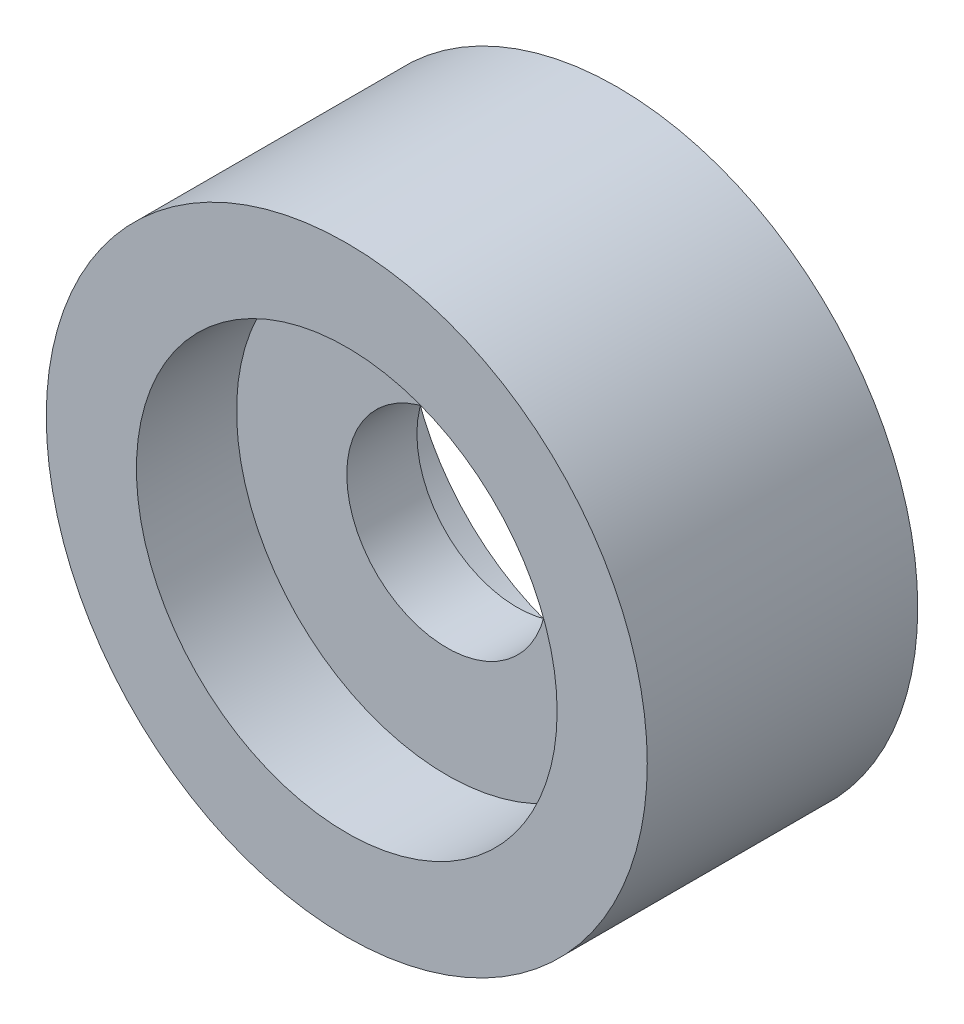
ISO-10303-21;
HEADER;
FILE_DESCRIPTION(('STEP AP214'),'2;1');
FILE_NAME('part.step','',(''),(''),'','','');
FILE_SCHEMA(('AUTOMOTIVE_DESIGN { 1 0 10303 214 1 1 1 1 }'));
ENDSEC;
DATA;
#1=APPLICATION_CONTEXT('core data for automotive mechanical design processes');
#2=APPLICATION_PROTOCOL_DEFINITION('international standard','automotive_design',2000,#1);
#3=PRODUCT_CONTEXT('',#1,'mechanical');
#4=PRODUCT('Part','Part','',(#3));
#5=PRODUCT_RELATED_PRODUCT_CATEGORY('part','',(#4));
#6=PRODUCT_DEFINITION_FORMATION('','',#4);
#7=PRODUCT_DEFINITION_CONTEXT('part definition',#1,'design');
#8=PRODUCT_DEFINITION('design','',#6,#7);
#9=PRODUCT_DEFINITION_SHAPE('','',#8);
#10=(LENGTH_UNIT() NAMED_UNIT(*) SI_UNIT(.MILLI.,.METRE.));
#11=(NAMED_UNIT(*) PLANE_ANGLE_UNIT() SI_UNIT($,.RADIAN.));
#12=(NAMED_UNIT(*) SI_UNIT($,.STERADIAN.) SOLID_ANGLE_UNIT());
#13=UNCERTAINTY_MEASURE_WITH_UNIT(LENGTH_MEASURE(1.E-05),#10,'distance_accuracy_value','');
#14=(GEOMETRIC_REPRESENTATION_CONTEXT(3) GLOBAL_UNCERTAINTY_ASSIGNED_CONTEXT((#13)) GLOBAL_UNIT_ASSIGNED_CONTEXT((#10,
#11,#12)) REPRESENTATION_CONTEXT('',''));
#15=CARTESIAN_POINT('',(0.,0.,0.));
#16=DIRECTION('',(0.,0.,1.));
#17=DIRECTION('',(1.,0.,0.));
#18=AXIS2_PLACEMENT_3D('',#15,#16,#17);
#19=CARTESIAN_POINT('',(0.,0.,27.));
#20=DIRECTION('',(0.,0.,-1.));
#21=DIRECTION('',(-1.,0.,0.));
#22=AXIS2_PLACEMENT_3D('',#19,#20,#21);
#23=CYLINDRICAL_SURFACE('',#22,30.);
#24=CARTESIAN_POINT('',(0.,0.,27.));
#25=DIRECTION('',(0.,0.,1.));
#26=DIRECTION('',(1.,0.,0.));
#27=AXIS2_PLACEMENT_3D('',#24,#25,#26);
#28=CIRCLE('',#27,30.);
#29=CARTESIAN_POINT('',(30.,0.,27.));
#30=VERTEX_POINT('',#29);
#31=EDGE_CURVE('E10',#30,#30,#28,.T.);
#32=ORIENTED_EDGE('',*,*,#31,.F.);
#33=EDGE_LOOP('',(#32));
#34=FACE_BOUND('',#33,.T.);
#35=CARTESIAN_POINT('',(0.,0.,0.));
#36=DIRECTION('',(0.,0.,1.));
#37=DIRECTION('',(1.,0.,0.));
#38=AXIS2_PLACEMENT_3D('',#35,#36,#37);
#39=CIRCLE('',#38,30.);
#40=CARTESIAN_POINT('',(30.,0.,0.));
#41=VERTEX_POINT('',#40);
#42=EDGE_CURVE('E34',#41,#41,#39,.T.);
#43=ORIENTED_EDGE('',*,*,#42,.T.);
#44=EDGE_LOOP('',(#43));
#45=FACE_BOUND('',#44,.T.);
#46=ADVANCED_FACE('F31',(#34,#45),#23,.T.);
#47=CARTESIAN_POINT('',(0.,0.,27.));
#48=DIRECTION('',(0.,0.,1.));
#49=DIRECTION('',(1.,0.,0.));
#50=AXIS2_PLACEMENT_3D('',#47,#48,#49);
#51=PLANE('',#50);
#52=CARTESIAN_POINT('',(0.,0.,27.));
#53=DIRECTION('',(0.,0.,1.));
#54=DIRECTION('',(1.,0.,0.));
#55=AXIS2_PLACEMENT_3D('',#52,#53,#54);
#56=CIRCLE('',#55,21.);
#57=CARTESIAN_POINT('',(21.,0.,27.));
#58=VERTEX_POINT('',#57);
#59=EDGE_CURVE('E43',#58,#58,#56,.T.);
#60=ORIENTED_EDGE('',*,*,#59,.F.);
#61=EDGE_LOOP('',(#60));
#62=FACE_BOUND('',#61,.T.);
#63=ORIENTED_EDGE('',*,*,#31,.T.);
#64=EDGE_LOOP('',(#63));
#65=FACE_BOUND('',#64,.T.);
#66=ADVANCED_FACE('F80',(#62,#65),#51,.T.);
#67=CARTESIAN_POINT('',(0.,0.,0.));
#68=DIRECTION('',(0.,0.,1.));
#69=DIRECTION('',(1.,0.,0.));
#70=AXIS2_PLACEMENT_3D('',#67,#68,#69);
#71=PLANE('',#70);
#72=CARTESIAN_POINT('',(0.,0.,0.));
#73=DIRECTION('',(0.,0.,-1.));
#74=DIRECTION('',(-1.,0.,0.));
#75=AXIS2_PLACEMENT_3D('',#72,#73,#74);
#76=CIRCLE('',#75,21.);
#77=CARTESIAN_POINT('',(-21.,0.,0.));
#78=VERTEX_POINT('',#77);
#79=EDGE_CURVE('E49',#78,#78,#76,.T.);
#80=ORIENTED_EDGE('',*,*,#79,.F.);
#81=EDGE_LOOP('',(#80));
#82=FACE_BOUND('',#81,.T.);
#83=ORIENTED_EDGE('',*,*,#42,.F.);
#84=EDGE_LOOP('',(#83));
#85=FACE_BOUND('',#84,.T.);
#86=ADVANCED_FACE('F76',(#82,#85),#71,.F.);
#87=CARTESIAN_POINT('',(0.,0.,17.));
#88=DIRECTION('',(0.,0.,1.));
#89=DIRECTION('',(1.,0.,0.));
#90=AXIS2_PLACEMENT_3D('',#87,#88,#89);
#91=CYLINDRICAL_SURFACE('',#90,21.);
#92=CARTESIAN_POINT('',(0.,0.,17.));
#93=DIRECTION('',(0.,0.,1.));
#94=DIRECTION('',(1.,0.,0.));
#95=AXIS2_PLACEMENT_3D('',#92,#93,#94);
#96=CIRCLE('',#95,21.);
#97=CARTESIAN_POINT('',(21.,0.,17.));
#98=VERTEX_POINT('',#97);
#99=EDGE_CURVE('E41',#98,#98,#96,.T.);
#100=ORIENTED_EDGE('',*,*,#99,.F.);
#101=EDGE_LOOP('',(#100));
#102=FACE_BOUND('',#101,.T.);
#103=ORIENTED_EDGE('',*,*,#59,.T.);
#104=EDGE_LOOP('',(#103));
#105=FACE_BOUND('',#104,.T.);
#106=ADVANCED_FACE('F79',(#102,#105),#91,.F.);
#107=CARTESIAN_POINT('',(0.,0.,17.));
#108=DIRECTION('',(0.,0.,1.));
#109=DIRECTION('',(1.,0.,0.));
#110=AXIS2_PLACEMENT_3D('',#107,#108,#109);
#111=PLANE('',#110);
#112=CARTESIAN_POINT('',(0.,0.,17.));
#113=DIRECTION('',(0.,0.,1.));
#114=DIRECTION('',(1.,0.,0.));
#115=AXIS2_PLACEMENT_3D('',#112,#113,#114);
#116=CIRCLE('',#115,10.);
#117=CARTESIAN_POINT('',(10.,0.,17.));
#118=VERTEX_POINT('',#117);
#119=EDGE_CURVE('E52',#118,#118,#116,.T.);
#120=ORIENTED_EDGE('',*,*,#119,.F.);
#121=EDGE_LOOP('',(#120));
#122=FACE_BOUND('',#121,.T.);
#123=ORIENTED_EDGE('',*,*,#99,.T.);
#124=EDGE_LOOP('',(#123));
#125=FACE_BOUND('',#124,.T.);
#126=ADVANCED_FACE('F72',(#122,#125),#111,.T.);
#127=CARTESIAN_POINT('',(0.,0.,10.));
#128=DIRECTION('',(0.,0.,-1.));
#129=DIRECTION('',(-1.,0.,0.));
#130=AXIS2_PLACEMENT_3D('',#127,#128,#129);
#131=CYLINDRICAL_SURFACE('',#130,21.);
#132=CARTESIAN_POINT('',(0.,0.,10.));
#133=DIRECTION('',(0.,0.,-1.));
#134=DIRECTION('',(-1.,0.,0.));
#135=AXIS2_PLACEMENT_3D('',#132,#133,#134);
#136=CIRCLE('',#135,21.);
#137=CARTESIAN_POINT('',(-21.,0.,10.));
#138=VERTEX_POINT('',#137);
#139=EDGE_CURVE('E46',#138,#138,#136,.T.);
#140=ORIENTED_EDGE('',*,*,#139,.F.);
#141=EDGE_LOOP('',(#140));
#142=FACE_BOUND('',#141,.T.);
#143=ORIENTED_EDGE('',*,*,#79,.T.);
#144=EDGE_LOOP('',(#143));
#145=FACE_BOUND('',#144,.T.);
#146=ADVANCED_FACE('F66',(#142,#145),#131,.F.);
#147=CARTESIAN_POINT('',(0.,0.,10.));
#148=DIRECTION('',(0.,0.,-1.));
#149=DIRECTION('',(-1.,0.,0.));
#150=AXIS2_PLACEMENT_3D('',#147,#148,#149);
#151=PLANE('',#150);
#152=CARTESIAN_POINT('',(0.,0.,10.));
#153=DIRECTION('',(0.,0.,-1.));
#154=DIRECTION('',(-1.,0.,0.));
#155=AXIS2_PLACEMENT_3D('',#152,#153,#154);
#156=CIRCLE('',#155,10.);
#157=CARTESIAN_POINT('',(-10.,0.,10.));
#158=VERTEX_POINT('',#157);
#159=EDGE_CURVE('E57',#158,#158,#156,.T.);
#160=ORIENTED_EDGE('',*,*,#159,.F.);
#161=EDGE_LOOP('',(#160));
#162=FACE_BOUND('',#161,.T.);
#163=ORIENTED_EDGE('',*,*,#139,.T.);
#164=EDGE_LOOP('',(#163));
#165=FACE_BOUND('',#164,.T.);
#166=ADVANCED_FACE('F63',(#162,#165),#151,.T.);
#167=CARTESIAN_POINT('',(0.,0.,20.));
#168=DIRECTION('',(0.,0.,-1.));
#169=DIRECTION('',(-1.,0.,0.));
#170=AXIS2_PLACEMENT_3D('',#167,#168,#169);
#171=CYLINDRICAL_SURFACE('',#170,10.);
#172=ORIENTED_EDGE('',*,*,#119,.T.);
#173=EDGE_LOOP('',(#172));
#174=FACE_BOUND('',#173,.T.);
#175=ORIENTED_EDGE('',*,*,#159,.T.);
#176=EDGE_LOOP('',(#175));
#177=FACE_BOUND('',#176,.T.);
#178=ADVANCED_FACE('F61',(#174,#177),#171,.F.);
#179=CLOSED_SHELL('',(#46,#66,#86,#106,#126,#146,#166,#178));
#180=MANIFOLD_SOLID_BREP('B2',#179);
#181=ADVANCED_BREP_SHAPE_REPRESENTATION('',(#18,#180),#14);
#182=SHAPE_DEFINITION_REPRESENTATION(#9,#181);
ENDSEC;
END-ISO-10303-21;
